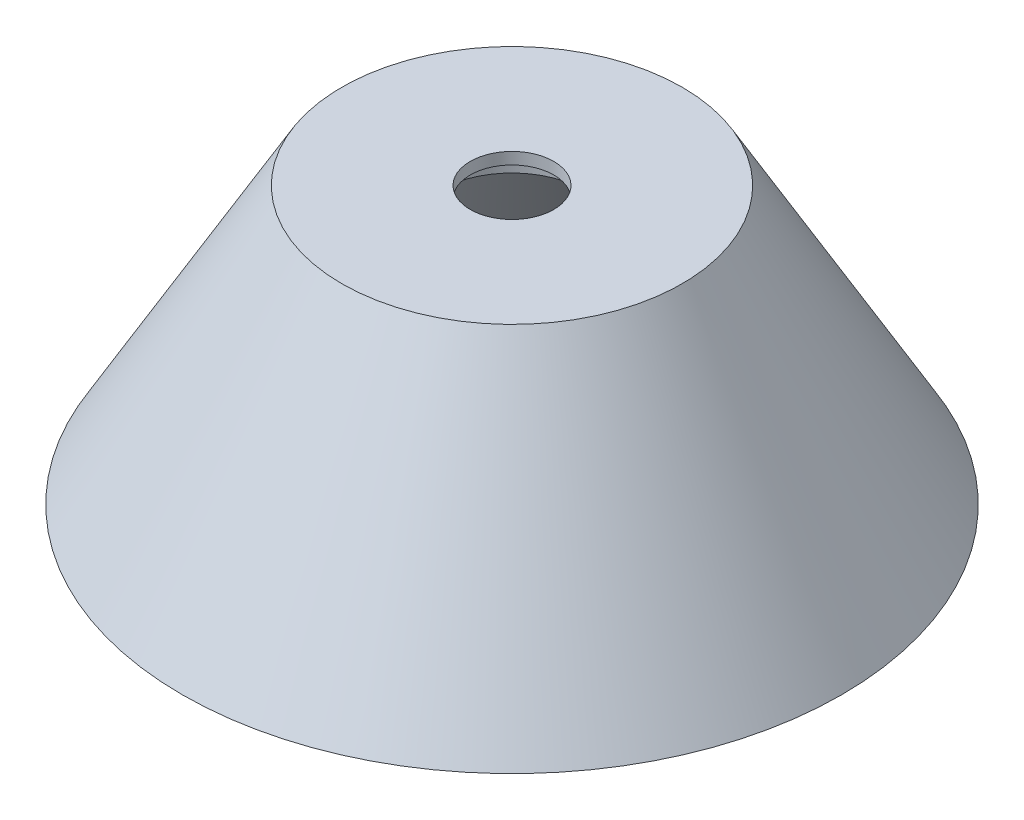
ISO-10303-21;
HEADER;
FILE_DESCRIPTION(('STEP AP214'),'2;1');
FILE_NAME('part.step','',(''),(''),'','','');
FILE_SCHEMA(('AUTOMOTIVE_DESIGN { 1 0 10303 214 1 1 1 1 }'));
ENDSEC;
DATA;
#1=APPLICATION_CONTEXT('core data for automotive mechanical design processes');
#2=APPLICATION_PROTOCOL_DEFINITION('international standard','automotive_design',2000,#1);
#3=PRODUCT_CONTEXT('',#1,'mechanical');
#4=PRODUCT('Part','Part','',(#3));
#5=PRODUCT_RELATED_PRODUCT_CATEGORY('part','',(#4));
#6=PRODUCT_DEFINITION_FORMATION('','',#4);
#7=PRODUCT_DEFINITION_CONTEXT('part definition',#1,'design');
#8=PRODUCT_DEFINITION('design','',#6,#7);
#9=PRODUCT_DEFINITION_SHAPE('','',#8);
#10=(LENGTH_UNIT() NAMED_UNIT(*) SI_UNIT(.MILLI.,.METRE.));
#11=(NAMED_UNIT(*) PLANE_ANGLE_UNIT() SI_UNIT($,.RADIAN.));
#12=(NAMED_UNIT(*) SI_UNIT($,.STERADIAN.) SOLID_ANGLE_UNIT());
#13=UNCERTAINTY_MEASURE_WITH_UNIT(LENGTH_MEASURE(1.E-05),#10,'distance_accuracy_value','');
#14=(GEOMETRIC_REPRESENTATION_CONTEXT(3) GLOBAL_UNCERTAINTY_ASSIGNED_CONTEXT((#13)) GLOBAL_UNIT_ASSIGNED_CONTEXT((#10,
#11,#12)) REPRESENTATION_CONTEXT('',''));
#15=CARTESIAN_POINT('',(0.,0.,0.));
#16=DIRECTION('',(0.,0.,1.));
#17=DIRECTION('',(1.,0.,0.));
#18=AXIS2_PLACEMENT_3D('',#15,#16,#17);
#19=CARTESIAN_POINT('',(0.,0.,0.));
#20=DIRECTION('',(0.,1.,0.));
#21=DIRECTION('',(0.,0.,1.));
#22=AXIS2_PLACEMENT_3D('',#19,#20,#21);
#23=PLANE('',#22);
#24=CARTESIAN_POINT('',(0.,0.,0.));
#25=DIRECTION('',(0.,-1.,0.));
#26=DIRECTION('',(0.,0.,-1.));
#27=AXIS2_PLACEMENT_3D('',#24,#25,#26);
#28=CIRCLE('',#27,12.5);
#29=CARTESIAN_POINT('',(0.,0.,-12.5));
#30=VERTEX_POINT('',#29);
#31=EDGE_CURVE('E59',#30,#30,#28,.T.);
#32=ORIENTED_EDGE('',*,*,#31,.F.);
#33=EDGE_LOOP('',(#32));
#34=FACE_BOUND('',#33,.T.);
#35=CARTESIAN_POINT('',(0.,0.,0.));
#36=DIRECTION('',(0.,-1.,0.));
#37=DIRECTION('',(0.,0.,-1.));
#38=AXIS2_PLACEMENT_3D('',#35,#36,#37);
#39=CIRCLE('',#38,30.);
#40=CARTESIAN_POINT('',(0.,0.,-30.));
#41=VERTEX_POINT('',#40);
#42=EDGE_CURVE('E10',#41,#41,#39,.T.);
#43=ORIENTED_EDGE('',*,*,#42,.T.);
#44=EDGE_LOOP('',(#43));
#45=FACE_BOUND('',#44,.T.);
#46=ADVANCED_FACE('F39',(#34,#45),#23,.F.);
#47=CARTESIAN_POINT('',(0.,-40.,0.));
#48=DIRECTION('',(0.,-1.,0.));
#49=DIRECTION('',(0.,0.,-1.));
#50=AXIS2_PLACEMENT_3D('',#47,#48,#49);
#51=CONICAL_SURFACE('',#50,53.0940107675849,0.523598775598296);
#52=ORIENTED_EDGE('',*,*,#42,.F.);
#53=EDGE_LOOP('',(#52));
#54=FACE_BOUND('',#53,.T.);
#55=CARTESIAN_POINT('',(0.,-40.,0.));
#56=DIRECTION('',(0.,-1.,0.));
#57=DIRECTION('',(0.,0.,-1.));
#58=AXIS2_PLACEMENT_3D('',#55,#56,#57);
#59=CIRCLE('',#58,53.0940107675849);
#60=CARTESIAN_POINT('',(0.,-40.,-53.0940107675849));
#61=VERTEX_POINT('',#60);
#62=EDGE_CURVE('E45',#61,#61,#59,.T.);
#63=ORIENTED_EDGE('',*,*,#62,.T.);
#64=EDGE_LOOP('',(#63));
#65=FACE_BOUND('',#64,.T.);
#66=ADVANCED_FACE('F93',(#54,#65),#51,.F.);
#67=CARTESIAN_POINT('',(-53.0940107675849,-40.,0.));
#68=DIRECTION('',(0.,1.,0.));
#69=DIRECTION('',(0.,0.,1.));
#70=AXIS2_PLACEMENT_3D('',#67,#68,#69);
#71=PLANE('',#70);
#72=ORIENTED_EDGE('',*,*,#62,.F.);
#73=EDGE_LOOP('',(#72));
#74=FACE_BOUND('',#73,.T.);
#75=CARTESIAN_POINT('',(0.,-40.,0.));
#76=DIRECTION('',(0.,-1.,0.));
#77=DIRECTION('',(0.,0.,-1.));
#78=AXIS2_PLACEMENT_3D('',#75,#76,#77);
#79=CIRCLE('',#78,56.0940107675849);
#80=CARTESIAN_POINT('',(0.,-40.,-56.0940107675849));
#81=VERTEX_POINT('',#80);
#82=EDGE_CURVE('E49',#81,#81,#79,.T.);
#83=ORIENTED_EDGE('',*,*,#82,.T.);
#84=EDGE_LOOP('',(#83));
#85=FACE_BOUND('',#84,.T.);
#86=ADVANCED_FACE('F98',(#74,#85),#71,.F.);
#87=CARTESIAN_POINT('',(0.,7.,0.));
#88=DIRECTION('',(0.,-1.,0.));
#89=DIRECTION('',(0.,0.,-1.));
#90=AXIS2_PLACEMENT_3D('',#87,#88,#89);
#91=CONICAL_SURFACE('',#90,28.9585481156727,0.523598775598296);
#92=ORIENTED_EDGE('',*,*,#82,.F.);
#93=EDGE_LOOP('',(#92));
#94=FACE_BOUND('',#93,.T.);
#95=CARTESIAN_POINT('',(0.,7.,0.));
#96=DIRECTION('',(0.,-1.,0.));
#97=DIRECTION('',(0.,0.,-1.));
#98=AXIS2_PLACEMENT_3D('',#95,#96,#97);
#99=CIRCLE('',#98,28.9585481156727);
#100=CARTESIAN_POINT('',(0.,7.,-28.9585481156727));
#101=VERTEX_POINT('',#100);
#102=EDGE_CURVE('E53',#101,#101,#99,.T.);
#103=ORIENTED_EDGE('',*,*,#102,.T.);
#104=EDGE_LOOP('',(#103));
#105=FACE_BOUND('',#104,.T.);
#106=ADVANCED_FACE('F103',(#94,#105),#91,.T.);
#107=CARTESIAN_POINT('',(-28.9585481156727,7.,0.));
#108=DIRECTION('',(0.,-1.,0.));
#109=DIRECTION('',(0.,0.,-1.));
#110=AXIS2_PLACEMENT_3D('',#107,#108,#109);
#111=PLANE('',#110);
#112=CARTESIAN_POINT('',(0.,7.,0.));
#113=DIRECTION('',(0.,-1.,0.));
#114=DIRECTION('',(0.,0.,-1.));
#115=AXIS2_PLACEMENT_3D('',#112,#113,#114);
#116=CIRCLE('',#115,7.1);
#117=CARTESIAN_POINT('',(0.,7.,-7.1));
#118=VERTEX_POINT('',#117);
#119=EDGE_CURVE('E62',#118,#118,#116,.T.);
#120=ORIENTED_EDGE('',*,*,#119,.T.);
#121=EDGE_LOOP('',(#120));
#122=FACE_BOUND('',#121,.T.);
#123=ORIENTED_EDGE('',*,*,#102,.F.);
#124=EDGE_LOOP('',(#123));
#125=FACE_BOUND('',#124,.T.);
#126=ADVANCED_FACE('F71',(#122,#125),#111,.F.);
#127=CARTESIAN_POINT('',(0.,5.,0.));
#128=DIRECTION('',(0.,-1.,0.));
#129=DIRECTION('',(0.,0.,-1.));
#130=AXIS2_PLACEMENT_3D('',#127,#128,#129);
#131=CYLINDRICAL_SURFACE('',#130,12.5);
#132=CARTESIAN_POINT('',(0.,5.,0.));
#133=DIRECTION('',(0.,-1.,0.));
#134=DIRECTION('',(0.,0.,-1.));
#135=AXIS2_PLACEMENT_3D('',#132,#133,#134);
#136=CIRCLE('',#135,12.5);
#137=CARTESIAN_POINT('',(0.,5.,-12.5));
#138=VERTEX_POINT('',#137);
#139=EDGE_CURVE('E58',#138,#138,#136,.T.);
#140=ORIENTED_EDGE('',*,*,#139,.F.);
#141=EDGE_LOOP('',(#140));
#142=FACE_BOUND('',#141,.T.);
#143=ORIENTED_EDGE('',*,*,#31,.T.);
#144=EDGE_LOOP('',(#143));
#145=FACE_BOUND('',#144,.T.);
#146=ADVANCED_FACE('F83',(#142,#145),#131,.F.);
#147=CARTESIAN_POINT('',(0.,5.,0.));
#148=DIRECTION('',(0.,-1.,0.));
#149=DIRECTION('',(0.,0.,-1.));
#150=AXIS2_PLACEMENT_3D('',#147,#148,#149);
#151=PLANE('',#150);
#152=CARTESIAN_POINT('',(0.,5.,0.));
#153=DIRECTION('',(0.,-1.,0.));
#154=DIRECTION('',(0.,0.,-1.));
#155=AXIS2_PLACEMENT_3D('',#152,#153,#154);
#156=CIRCLE('',#155,7.1);
#157=CARTESIAN_POINT('',(0.,5.,-7.1));
#158=VERTEX_POINT('',#157);
#159=EDGE_CURVE('E65',#158,#158,#156,.T.);
#160=ORIENTED_EDGE('',*,*,#159,.F.);
#161=EDGE_LOOP('',(#160));
#162=FACE_BOUND('',#161,.T.);
#163=ORIENTED_EDGE('',*,*,#139,.T.);
#164=EDGE_LOOP('',(#163));
#165=FACE_BOUND('',#164,.T.);
#166=ADVANCED_FACE('F77',(#162,#165),#151,.T.);
#167=CARTESIAN_POINT('',(0.,7.,0.));
#168=DIRECTION('',(0.,-1.,0.));
#169=DIRECTION('',(0.,0.,-1.));
#170=AXIS2_PLACEMENT_3D('',#167,#168,#169);
#171=CYLINDRICAL_SURFACE('',#170,7.1);
#172=ORIENTED_EDGE('',*,*,#119,.F.);
#173=EDGE_LOOP('',(#172));
#174=FACE_BOUND('',#173,.T.);
#175=ORIENTED_EDGE('',*,*,#159,.T.);
#176=EDGE_LOOP('',(#175));
#177=FACE_BOUND('',#176,.T.);
#178=ADVANCED_FACE('F74',(#174,#177),#171,.F.);
#179=CLOSED_SHELL('',(#46,#66,#86,#106,#126,#146,#166,#178));
#180=MANIFOLD_SOLID_BREP('B2',#179);
#181=ADVANCED_BREP_SHAPE_REPRESENTATION('',(#18,#180),#14);
#182=SHAPE_DEFINITION_REPRESENTATION(#9,#181);
ENDSEC;
END-ISO-10303-21;
